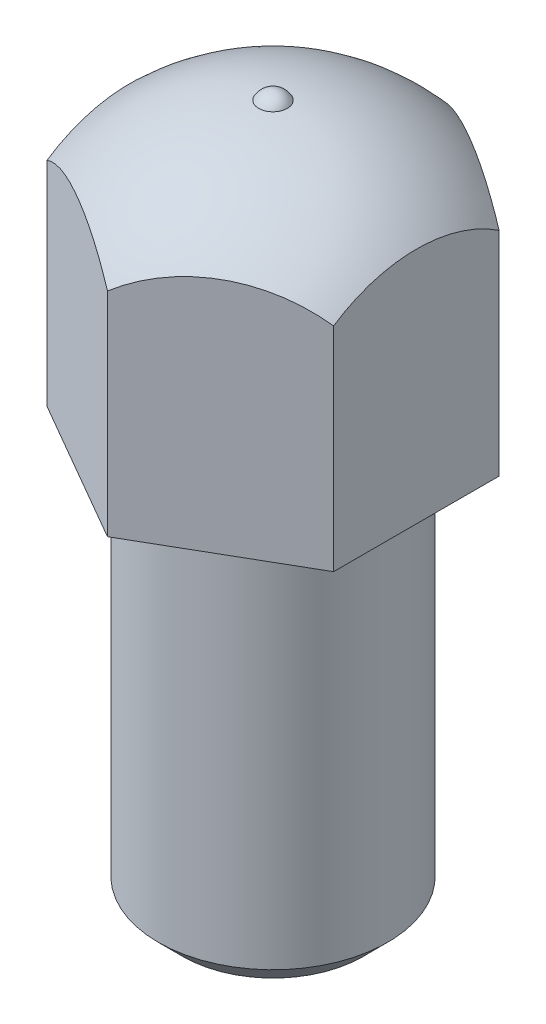
ISO-10303-21;
HEADER;
FILE_DESCRIPTION(('STEP AP214'),'2;1');
FILE_NAME('part.step','',(''),(''),'','','');
FILE_SCHEMA(('AUTOMOTIVE_DESIGN { 1 0 10303 214 1 1 1 1 }'));
ENDSEC;
DATA;
#1=APPLICATION_CONTEXT('core data for automotive mechanical design processes');
#2=APPLICATION_PROTOCOL_DEFINITION('international standard','automotive_design',2000,#1);
#3=PRODUCT_CONTEXT('',#1,'mechanical');
#4=PRODUCT('Part','Part','',(#3));
#5=PRODUCT_RELATED_PRODUCT_CATEGORY('part','',(#4));
#6=PRODUCT_DEFINITION_FORMATION('','',#4);
#7=PRODUCT_DEFINITION_CONTEXT('part definition',#1,'design');
#8=PRODUCT_DEFINITION('design','',#6,#7);
#9=PRODUCT_DEFINITION_SHAPE('','',#8);
#10=(LENGTH_UNIT() NAMED_UNIT(*) SI_UNIT(.MILLI.,.METRE.));
#11=(NAMED_UNIT(*) PLANE_ANGLE_UNIT() SI_UNIT($,.RADIAN.));
#12=(NAMED_UNIT(*) SI_UNIT($,.STERADIAN.) SOLID_ANGLE_UNIT());
#13=UNCERTAINTY_MEASURE_WITH_UNIT(LENGTH_MEASURE(1.E-05),#10,'distance_accuracy_value','');
#14=(GEOMETRIC_REPRESENTATION_CONTEXT(3) GLOBAL_UNCERTAINTY_ASSIGNED_CONTEXT((#13)) GLOBAL_UNIT_ASSIGNED_CONTEXT((#10,
#11,#12)) REPRESENTATION_CONTEXT('',''));
#15=CARTESIAN_POINT('',(0.,0.,0.));
#16=DIRECTION('',(0.,0.,1.));
#17=DIRECTION('',(1.,0.,0.));
#18=AXIS2_PLACEMENT_3D('',#15,#16,#17);
#19=CARTESIAN_POINT('',(3.,0.,0.));
#20=DIRECTION('',(0.,1.,0.));
#21=DIRECTION('',(0.,0.,1.));
#22=AXIS2_PLACEMENT_3D('',#19,#20,#21);
#23=PLANE('',#22);
#24=DIRECTION('',(0.,0.,1.));
#25=VECTOR('',#24,1.);
#26=CARTESIAN_POINT('',(-2.5,0.,-1.4433756729741));
#27=LINE('',#26,#25);
#28=CARTESIAN_POINT('',(-2.5,0.,-1.4433756729741));
#29=VERTEX_POINT('',#28);
#30=CARTESIAN_POINT('',(-2.5,0.,1.4433756729741));
#31=VERTEX_POINT('',#30);
#32=EDGE_CURVE('E93',#29,#31,#27,.T.);
#33=ORIENTED_EDGE('',*,*,#32,.F.);
#34=DIRECTION('',(-0.866025403784448,0.,0.499999999999983));
#35=VECTOR('',#34,1.);
#36=CARTESIAN_POINT('',(0.,0.,-2.8867513459481));
#37=LINE('',#36,#35);
#38=CARTESIAN_POINT('',(0.,0.,-2.8867513459481));
#39=VERTEX_POINT('',#38);
#40=EDGE_CURVE('E103',#39,#29,#37,.T.);
#41=ORIENTED_EDGE('',*,*,#40,.F.);
#42=DIRECTION('',(-0.866025403784448,0.,-0.499999999999983));
#43=VECTOR('',#42,1.);
#44=CARTESIAN_POINT('',(2.5,0.,-1.4433756729741));
#45=LINE('',#44,#43);
#46=CARTESIAN_POINT('',(2.5,0.,-1.4433756729741));
#47=VERTEX_POINT('',#46);
#48=EDGE_CURVE('E119',#47,#39,#45,.T.);
#49=ORIENTED_EDGE('',*,*,#48,.F.);
#50=DIRECTION('',(0.,0.,-1.));
#51=VECTOR('',#50,1.);
#52=CARTESIAN_POINT('',(2.5,0.,1.4433756729741));
#53=LINE('',#52,#51);
#54=CARTESIAN_POINT('',(2.5,0.,1.4433756729741));
#55=VERTEX_POINT('',#54);
#56=EDGE_CURVE('E57',#55,#47,#53,.T.);
#57=ORIENTED_EDGE('',*,*,#56,.F.);
#58=DIRECTION('',(0.866025403784448,0.,-0.499999999999983));
#59=VECTOR('',#58,1.);
#60=CARTESIAN_POINT('',(0.,0.,2.8867513459481));
#61=LINE('',#60,#59);
#62=CARTESIAN_POINT('',(0.,0.,2.8867513459481));
#63=VERTEX_POINT('',#62);
#64=EDGE_CURVE('E113',#63,#55,#61,.T.);
#65=ORIENTED_EDGE('',*,*,#64,.F.);
#66=DIRECTION('',(0.866025403784448,0.,0.499999999999983));
#67=VECTOR('',#66,1.);
#68=CARTESIAN_POINT('',(-2.5,0.,1.4433756729741));
#69=LINE('',#68,#67);
#70=EDGE_CURVE('E111',#31,#63,#69,.T.);
#71=ORIENTED_EDGE('',*,*,#70,.F.);
#72=EDGE_LOOP('',(#33,#41,#49,#57,#65,#71));
#73=FACE_BOUND('',#72,.T.);
#74=CARTESIAN_POINT('',(0.,0.,0.));
#75=DIRECTION('',(0.,1.,0.));
#76=DIRECTION('',(0.,0.,1.));
#77=AXIS2_PLACEMENT_3D('',#74,#75,#76);
#78=CIRCLE('',#77,2.);
#79=CARTESIAN_POINT('',(0.,0.,2.));
#80=VERTEX_POINT('',#79);
#81=EDGE_CURVE('E42',#80,#80,#78,.T.);
#82=ORIENTED_EDGE('',*,*,#81,.T.);
#83=EDGE_LOOP('',(#82));
#84=FACE_BOUND('',#83,.T.);
#85=ADVANCED_FACE('F34',(#73,#84),#23,.F.);
#86=CARTESIAN_POINT('',(0.,-7.,0.));
#87=DIRECTION('',(0.,1.,0.));
#88=DIRECTION('',(0.,0.,1.));
#89=AXIS2_PLACEMENT_3D('',#86,#87,#88);
#90=CYLINDRICAL_SURFACE('',#89,2.);
#91=ORIENTED_EDGE('',*,*,#81,.F.);
#92=EDGE_LOOP('',(#91));
#93=FACE_BOUND('',#92,.T.);
#94=CARTESIAN_POINT('',(0.,-6.5705,0.));
#95=DIRECTION('',(0.,1.,0.));
#96=DIRECTION('',(0.,0.,1.));
#97=AXIS2_PLACEMENT_3D('',#94,#95,#96);
#98=CIRCLE('',#97,2.);
#99=CARTESIAN_POINT('',(0.,-6.5705,2.));
#100=VERTEX_POINT('',#99);
#101=EDGE_CURVE('E146',#100,#100,#98,.T.);
#102=ORIENTED_EDGE('',*,*,#101,.T.);
#103=EDGE_LOOP('',(#102));
#104=FACE_BOUND('',#103,.T.);
#105=ADVANCED_FACE('F151',(#93,#104),#90,.T.);
#106=CARTESIAN_POINT('',(0.,-7.,0.));
#107=DIRECTION('',(0.,1.,0.));
#108=DIRECTION('',(0.,0.,1.));
#109=AXIS2_PLACEMENT_3D('',#106,#107,#108);
#110=CONICAL_SURFACE('',#109,1.5705,0.785398163397448);
#111=ORIENTED_EDGE('',*,*,#101,.F.);
#112=EDGE_LOOP('',(#111));
#113=FACE_BOUND('',#112,.T.);
#114=CARTESIAN_POINT('',(0.,-7.,0.));
#115=DIRECTION('',(0.,1.,0.));
#116=DIRECTION('',(0.,0.,1.));
#117=AXIS2_PLACEMENT_3D('',#114,#115,#116);
#118=CIRCLE('',#117,1.5705);
#119=CARTESIAN_POINT('',(0.,-7.,1.5705));
#120=VERTEX_POINT('',#119);
#121=EDGE_CURVE('E143',#120,#120,#118,.T.);
#122=ORIENTED_EDGE('',*,*,#121,.T.);
#123=EDGE_LOOP('',(#122));
#124=FACE_BOUND('',#123,.T.);
#125=ADVANCED_FACE('F154',(#113,#124),#110,.T.);
#126=CARTESIAN_POINT('',(1.5705,-7.,0.));
#127=DIRECTION('',(0.,1.,0.));
#128=DIRECTION('',(0.,0.,1.));
#129=AXIS2_PLACEMENT_3D('',#126,#127,#128);
#130=PLANE('',#129);
#131=ORIENTED_EDGE('',*,*,#121,.F.);
#132=EDGE_LOOP('',(#131));
#133=FACE_BOUND('',#132,.T.);
#134=ADVANCED_FACE('F160',(#133),#130,.F.);
#135=CARTESIAN_POINT('',(0.,5.3,-2.8867513459481));
#136=DIRECTION('',(0.499999999999983,0.,0.866025403784448));
#137=DIRECTION('',(0.866025403784448,0.,-0.499999999999983));
#138=AXIS2_PLACEMENT_3D('',#135,#136,#137);
#139=PLANE('',#138);
#140=DIRECTION('',(0.,-1.,0.));
#141=VECTOR('',#140,1.);
#142=CARTESIAN_POINT('',(0.,5.3,-2.8867513459481));
#143=LINE('',#142,#141);
#144=CARTESIAN_POINT('',(0.,3.71129193211337,-2.8867513459481));
#145=VERTEX_POINT('',#144);
#146=EDGE_CURVE('E49',#145,#39,#143,.T.);
#147=ORIENTED_EDGE('',*,*,#146,.T.);
#148=ORIENTED_EDGE('',*,*,#40,.T.);
#149=DIRECTION('',(0.,-1.,0.));
#150=VECTOR('',#149,1.);
#151=CARTESIAN_POINT('',(-2.5,5.3,-1.4433756729741));
#152=LINE('',#151,#150);
#153=CARTESIAN_POINT('',(-2.5,3.71129193211333,-1.4433756729741));
#154=VERTEX_POINT('',#153);
#155=EDGE_CURVE('E88',#154,#29,#152,.T.);
#156=ORIENTED_EDGE('',*,*,#155,.F.);
#157=CARTESIAN_POINT('',(-1.24999999999997,1.55624999999997,-2.16506350946111));
#158=DIRECTION('',(0.499999999999983,0.,0.866025403784448));
#159=DIRECTION('',(0.866025403784448,0.,-0.499999999999983));
#160=AXIS2_PLACEMENT_3D('',#157,#158,#159);
#161=CIRCLE('',#160,2.59375000000005);
#162=EDGE_CURVE('E141',#145,#154,#161,.T.);
#163=ORIENTED_EDGE('',*,*,#162,.F.);
#164=EDGE_LOOP('',(#147,#148,#156,#163));
#165=FACE_BOUND('',#164,.T.);
#166=ADVANCED_FACE('F104',(#165),#139,.F.);
#167=CARTESIAN_POINT('',(-2.5,5.3,-1.4433756729741));
#168=DIRECTION('',(1.,0.,0.));
#169=DIRECTION('',(0.,0.,-1.));
#170=AXIS2_PLACEMENT_3D('',#167,#168,#169);
#171=PLANE('',#170);
#172=ORIENTED_EDGE('',*,*,#155,.T.);
#173=ORIENTED_EDGE('',*,*,#32,.T.);
#174=DIRECTION('',(0.,-1.,0.));
#175=VECTOR('',#174,1.);
#176=CARTESIAN_POINT('',(-2.5,5.3,1.4433756729741));
#177=LINE('',#176,#175);
#178=CARTESIAN_POINT('',(-2.5,3.71129193211333,1.4433756729741));
#179=VERTEX_POINT('',#178);
#180=EDGE_CURVE('E100',#179,#31,#177,.T.);
#181=ORIENTED_EDGE('',*,*,#180,.F.);
#182=CARTESIAN_POINT('',(-2.5,1.55624999999997,0.));
#183=DIRECTION('',(1.,0.,0.));
#184=DIRECTION('',(0.,0.,-1.));
#185=AXIS2_PLACEMENT_3D('',#182,#183,#184);
#186=CIRCLE('',#185,2.59375000000006);
#187=EDGE_CURVE('E96',#154,#179,#186,.T.);
#188=ORIENTED_EDGE('',*,*,#187,.F.);
#189=EDGE_LOOP('',(#172,#173,#181,#188));
#190=FACE_BOUND('',#189,.T.);
#191=ADVANCED_FACE('F90',(#190),#171,.F.);
#192=CARTESIAN_POINT('',(-2.5,5.3,1.4433756729741));
#193=DIRECTION('',(0.499999999999983,0.,-0.866025403784448));
#194=DIRECTION('',(-0.866025403784448,0.,-0.499999999999983));
#195=AXIS2_PLACEMENT_3D('',#192,#193,#194);
#196=PLANE('',#195);
#197=ORIENTED_EDGE('',*,*,#180,.T.);
#198=ORIENTED_EDGE('',*,*,#70,.T.);
#199=DIRECTION('',(0.,-1.,0.));
#200=VECTOR('',#199,1.);
#201=CARTESIAN_POINT('',(0.,5.3,2.8867513459481));
#202=LINE('',#201,#200);
#203=CARTESIAN_POINT('',(0.,3.71129193211337,2.8867513459481));
#204=VERTEX_POINT('',#203);
#205=EDGE_CURVE('E126',#204,#63,#202,.T.);
#206=ORIENTED_EDGE('',*,*,#205,.F.);
#207=CARTESIAN_POINT('',(-1.24999999999997,1.55624999999997,2.16506350946112));
#208=DIRECTION('',(0.499999999999983,0.,-0.866025403784448));
#209=DIRECTION('',(-0.866025403784448,0.,-0.499999999999983));
#210=AXIS2_PLACEMENT_3D('',#207,#208,#209);
#211=CIRCLE('',#210,2.59375000000005);
#212=EDGE_CURVE('E137',#179,#204,#211,.T.);
#213=ORIENTED_EDGE('',*,*,#212,.F.);
#214=EDGE_LOOP('',(#197,#198,#206,#213));
#215=FACE_BOUND('',#214,.T.);
#216=ADVANCED_FACE('F190',(#215),#196,.F.);
#217=CARTESIAN_POINT('',(0.,5.3,2.8867513459481));
#218=DIRECTION('',(-0.499999999999983,0.,-0.866025403784448));
#219=DIRECTION('',(-0.866025403784448,0.,0.499999999999983));
#220=AXIS2_PLACEMENT_3D('',#217,#218,#219);
#221=PLANE('',#220);
#222=ORIENTED_EDGE('',*,*,#205,.T.);
#223=ORIENTED_EDGE('',*,*,#64,.T.);
#224=DIRECTION('',(0.,-1.,0.));
#225=VECTOR('',#224,1.);
#226=CARTESIAN_POINT('',(2.5,5.3,1.4433756729741));
#227=LINE('',#226,#225);
#228=CARTESIAN_POINT('',(2.5,3.71129193211328,1.4433756729741));
#229=VERTEX_POINT('',#228);
#230=EDGE_CURVE('E124',#229,#55,#227,.T.);
#231=ORIENTED_EDGE('',*,*,#230,.F.);
#232=CARTESIAN_POINT('',(1.24999999999994,1.55624999999997,2.16506350946113));
#233=DIRECTION('',(-0.499999999999983,0.,-0.866025403784448));
#234=DIRECTION('',(-0.866025403784448,0.,0.499999999999983));
#235=AXIS2_PLACEMENT_3D('',#232,#233,#234);
#236=CIRCLE('',#235,2.59375000000003);
#237=EDGE_CURVE('E134',#204,#229,#236,.T.);
#238=ORIENTED_EDGE('',*,*,#237,.F.);
#239=EDGE_LOOP('',(#222,#223,#231,#238));
#240=FACE_BOUND('',#239,.T.);
#241=ADVANCED_FACE('F187',(#240),#221,.F.);
#242=CARTESIAN_POINT('',(2.5,5.3,1.4433756729741));
#243=DIRECTION('',(-1.,0.,0.));
#244=DIRECTION('',(0.,0.,1.));
#245=AXIS2_PLACEMENT_3D('',#242,#243,#244);
#246=PLANE('',#245);
#247=ORIENTED_EDGE('',*,*,#230,.T.);
#248=ORIENTED_EDGE('',*,*,#56,.T.);
#249=DIRECTION('',(0.,-1.,0.));
#250=VECTOR('',#249,1.);
#251=CARTESIAN_POINT('',(2.5,5.3,-1.4433756729741));
#252=LINE('',#251,#250);
#253=CARTESIAN_POINT('',(2.5,3.71129193211328,-1.4433756729741));
#254=VERTEX_POINT('',#253);
#255=EDGE_CURVE('E122',#254,#47,#252,.T.);
#256=ORIENTED_EDGE('',*,*,#255,.F.);
#257=CARTESIAN_POINT('',(2.5,1.55624999999997,0.));
#258=DIRECTION('',(-1.,0.,0.));
#259=DIRECTION('',(0.,0.,1.));
#260=AXIS2_PLACEMENT_3D('',#257,#258,#259);
#261=CIRCLE('',#260,2.59375000000002);
#262=EDGE_CURVE('E131',#229,#254,#261,.T.);
#263=ORIENTED_EDGE('',*,*,#262,.F.);
#264=EDGE_LOOP('',(#247,#248,#256,#263));
#265=FACE_BOUND('',#264,.T.);
#266=ADVANCED_FACE('F184',(#265),#246,.F.);
#267=CARTESIAN_POINT('',(2.5,5.3,-1.4433756729741));
#268=DIRECTION('',(-0.499999999999983,0.,0.866025403784448));
#269=DIRECTION('',(0.866025403784448,0.,0.499999999999983));
#270=AXIS2_PLACEMENT_3D('',#267,#268,#269);
#271=PLANE('',#270);
#272=ORIENTED_EDGE('',*,*,#255,.T.);
#273=ORIENTED_EDGE('',*,*,#48,.T.);
#274=ORIENTED_EDGE('',*,*,#146,.F.);
#275=CARTESIAN_POINT('',(1.24999999999994,1.55624999999997,-2.16506350946113));
#276=DIRECTION('',(-0.499999999999983,0.,0.866025403784448));
#277=DIRECTION('',(0.866025403784448,0.,0.499999999999983));
#278=AXIS2_PLACEMENT_3D('',#275,#276,#277);
#279=CIRCLE('',#278,2.59375000000003);
#280=EDGE_CURVE('E99',#254,#145,#279,.T.);
#281=ORIENTED_EDGE('',*,*,#280,.F.);
#282=EDGE_LOOP('',(#272,#273,#274,#281));
#283=FACE_BOUND('',#282,.T.);
#284=ADVANCED_FACE('F180',(#283),#271,.F.);
#285=CARTESIAN_POINT('',(1.37097364710792E-13,5.01666666666689,0.));
#286=DIRECTION('',(0.,1.,0.));
#287=DIRECTION('',(1.,0.,0.));
#288=AXIS2_PLACEMENT_3D('',#285,#286,#287);
#289=SPHERICAL_SURFACE('',#288,0.283333333333105);
#290=CARTESIAN_POINT('',(0.,5.15,0.));
#291=DIRECTION('',(0.,1.,0.));
#292=DIRECTION('',(0.,0.,1.));
#293=AXIS2_PLACEMENT_3D('',#290,#291,#292);
#294=CIRCLE('',#293,0.25);
#295=CARTESIAN_POINT('',(0.,5.15,0.25));
#296=VERTEX_POINT('',#295);
#297=EDGE_CURVE('E11',#296,#296,#294,.T.);
#298=ORIENTED_EDGE('',*,*,#297,.T.);
#299=EDGE_LOOP('',(#298));
#300=FACE_BOUND('',#299,.T.);
#301=ADVANCED_FACE('F36',(#300),#289,.T.);
#302=CARTESIAN_POINT('',(0.,1.55624999999997,0.));
#303=DIRECTION('',(0.,1.,0.));
#304=DIRECTION('',(1.,0.,0.));
#305=AXIS2_PLACEMENT_3D('',#302,#303,#304);
#306=SPHERICAL_SURFACE('',#305,3.60243515729294);
#307=ORIENTED_EDGE('',*,*,#280,.T.);
#308=ORIENTED_EDGE('',*,*,#162,.T.);
#309=ORIENTED_EDGE('',*,*,#187,.T.);
#310=ORIENTED_EDGE('',*,*,#212,.T.);
#311=ORIENTED_EDGE('',*,*,#237,.T.);
#312=ORIENTED_EDGE('',*,*,#262,.T.);
#313=EDGE_LOOP('',(#307,#308,#309,#310,#311,#312));
#314=FACE_BOUND('',#313,.T.);
#315=ORIENTED_EDGE('',*,*,#297,.F.);
#316=EDGE_LOOP('',(#315));
#317=FACE_BOUND('',#316,.T.);
#318=ADVANCED_FACE('F174',(#314,#317),#306,.T.);
#319=CLOSED_SHELL('',(#85,#105,#125,#134,#166,#191,#216,#241,#266,#284,#301,#318));
#320=MANIFOLD_SOLID_BREP('B2',#319);
#321=ADVANCED_BREP_SHAPE_REPRESENTATION('',(#18,#320),#14);
#322=SHAPE_DEFINITION_REPRESENTATION(#9,#321);
ENDSEC;
END-ISO-10303-21;
